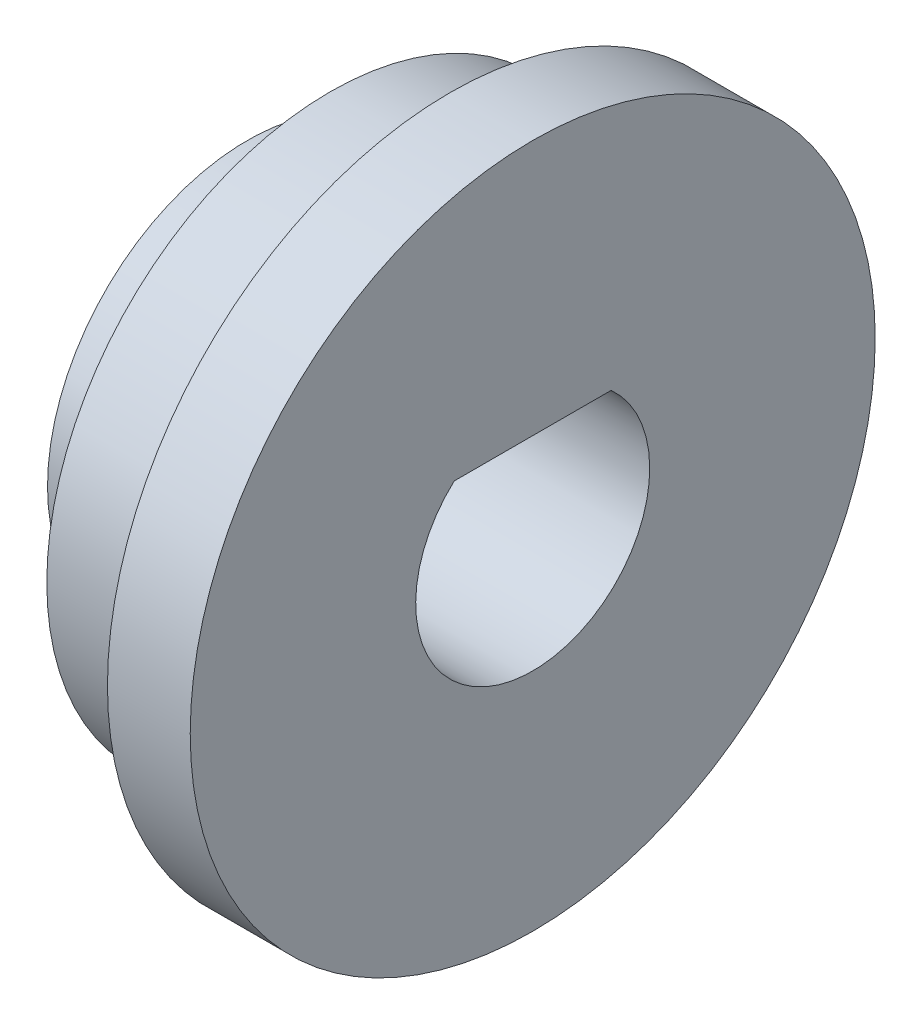
ISO-10303-21;
HEADER;
FILE_DESCRIPTION(('STEP AP214'),'2;1');
FILE_NAME('part.step','',(''),(''),'','','');
FILE_SCHEMA(('AUTOMOTIVE_DESIGN { 1 0 10303 214 1 1 1 1 }'));
ENDSEC;
DATA;
#1=APPLICATION_CONTEXT('core data for automotive mechanical design processes');
#2=APPLICATION_PROTOCOL_DEFINITION('international standard','automotive_design',2000,#1);
#3=PRODUCT_CONTEXT('',#1,'mechanical');
#4=PRODUCT('Part','Part','',(#3));
#5=PRODUCT_RELATED_PRODUCT_CATEGORY('part','',(#4));
#6=PRODUCT_DEFINITION_FORMATION('','',#4);
#7=PRODUCT_DEFINITION_CONTEXT('part definition',#1,'design');
#8=PRODUCT_DEFINITION('design','',#6,#7);
#9=PRODUCT_DEFINITION_SHAPE('','',#8);
#10=(LENGTH_UNIT() NAMED_UNIT(*) SI_UNIT(.MILLI.,.METRE.));
#11=(NAMED_UNIT(*) PLANE_ANGLE_UNIT() SI_UNIT($,.RADIAN.));
#12=(NAMED_UNIT(*) SI_UNIT($,.STERADIAN.) SOLID_ANGLE_UNIT());
#13=UNCERTAINTY_MEASURE_WITH_UNIT(LENGTH_MEASURE(1.E-05),#10,'distance_accuracy_value','');
#14=(GEOMETRIC_REPRESENTATION_CONTEXT(3) GLOBAL_UNCERTAINTY_ASSIGNED_CONTEXT((#13)) GLOBAL_UNIT_ASSIGNED_CONTEXT((#10,
#11,#12)) REPRESENTATION_CONTEXT('',''));
#15=CARTESIAN_POINT('',(0.,0.,0.));
#16=DIRECTION('',(0.,0.,1.));
#17=DIRECTION('',(1.,0.,0.));
#18=AXIS2_PLACEMENT_3D('',#15,#16,#17);
#19=CARTESIAN_POINT('',(0.,0.,0.));
#20=DIRECTION('',(-1.,0.,0.));
#21=DIRECTION('',(0.,0.,1.));
#22=AXIS2_PLACEMENT_3D('',#19,#20,#21);
#23=PLANE('',#22);
#24=CARTESIAN_POINT('',(0.,0.,0.));
#25=DIRECTION('',(-1.,0.,0.));
#26=DIRECTION('',(0.,0.,1.));
#27=AXIS2_PLACEMENT_3D('',#24,#25,#26);
#28=CIRCLE('',#27,4.1);
#29=CARTESIAN_POINT('',(0.,3.04097023990699,-2.75));
#30=VERTEX_POINT('',#29);
#31=CARTESIAN_POINT('',(0.,3.04097023990699,2.75));
#32=VERTEX_POINT('',#31);
#33=EDGE_CURVE('E54',#30,#32,#28,.T.);
#34=ORIENTED_EDGE('',*,*,#33,.F.);
#35=DIRECTION('',(0.,0.,-1.));
#36=VECTOR('',#35,1.);
#37=CARTESIAN_POINT('',(0.,3.04097023990699,-2.75));
#38=LINE('',#37,#36);
#39=EDGE_CURVE('E73',#32,#30,#38,.T.);
#40=ORIENTED_EDGE('',*,*,#39,.F.);
#41=EDGE_LOOP('',(#34,#40));
#42=FACE_BOUND('',#41,.T.);
#43=CARTESIAN_POINT('',(0.,0.,0.));
#44=DIRECTION('',(1.,0.,0.));
#45=DIRECTION('',(0.,0.,-1.));
#46=AXIS2_PLACEMENT_3D('',#43,#44,#45);
#47=CIRCLE('',#46,7.);
#48=CARTESIAN_POINT('',(0.,0.,-7.));
#49=VERTEX_POINT('',#48);
#50=EDGE_CURVE('E11',#49,#49,#47,.T.);
#51=ORIENTED_EDGE('',*,*,#50,.F.);
#52=EDGE_LOOP('',(#51));
#53=FACE_BOUND('',#52,.T.);
#54=ADVANCED_FACE('F41',(#42,#53),#23,.T.);
#55=CARTESIAN_POINT('',(0.,0.,0.));
#56=DIRECTION('',(1.,0.,0.));
#57=DIRECTION('',(0.,0.,-1.));
#58=AXIS2_PLACEMENT_3D('',#55,#56,#57);
#59=CYLINDRICAL_SURFACE('',#58,7.);
#60=ORIENTED_EDGE('',*,*,#50,.T.);
#61=EDGE_LOOP('',(#60));
#62=FACE_BOUND('',#61,.T.);
#63=CARTESIAN_POINT('',(2.9,0.,0.));
#64=DIRECTION('',(1.,0.,0.));
#65=DIRECTION('',(0.,0.,-1.));
#66=AXIS2_PLACEMENT_3D('',#63,#64,#65);
#67=CIRCLE('',#66,7.);
#68=CARTESIAN_POINT('',(2.9,0.,-7.));
#69=VERTEX_POINT('',#68);
#70=EDGE_CURVE('E48',#69,#69,#67,.T.);
#71=ORIENTED_EDGE('',*,*,#70,.F.);
#72=EDGE_LOOP('',(#71));
#73=FACE_BOUND('',#72,.T.);
#74=ADVANCED_FACE('F105',(#62,#73),#59,.T.);
#75=CARTESIAN_POINT('',(2.9,7.,0.));
#76=DIRECTION('',(-1.,0.,0.));
#77=DIRECTION('',(0.,0.,1.));
#78=AXIS2_PLACEMENT_3D('',#75,#76,#77);
#79=PLANE('',#78);
#80=ORIENTED_EDGE('',*,*,#70,.T.);
#81=EDGE_LOOP('',(#80));
#82=FACE_BOUND('',#81,.T.);
#83=CARTESIAN_POINT('',(2.9,0.,0.));
#84=DIRECTION('',(1.,0.,0.));
#85=DIRECTION('',(0.,0.,-1.));
#86=AXIS2_PLACEMENT_3D('',#83,#84,#85);
#87=CIRCLE('',#86,9.925);
#88=CARTESIAN_POINT('',(2.9,0.,-9.925));
#89=VERTEX_POINT('',#88);
#90=EDGE_CURVE('E94',#89,#89,#87,.T.);
#91=ORIENTED_EDGE('',*,*,#90,.F.);
#92=EDGE_LOOP('',(#91));
#93=FACE_BOUND('',#92,.T.);
#94=ADVANCED_FACE('F97',(#82,#93),#79,.T.);
#95=CARTESIAN_POINT('',(0.,0.,0.));
#96=DIRECTION('',(1.,0.,0.));
#97=DIRECTION('',(0.,0.,-1.));
#98=AXIS2_PLACEMENT_3D('',#95,#96,#97);
#99=CYLINDRICAL_SURFACE('',#98,9.925);
#100=ORIENTED_EDGE('',*,*,#90,.T.);
#101=EDGE_LOOP('',(#100));
#102=FACE_BOUND('',#101,.T.);
#103=CARTESIAN_POINT('',(7.1,0.,0.));
#104=DIRECTION('',(1.,0.,0.));
#105=DIRECTION('',(0.,0.,-1.));
#106=AXIS2_PLACEMENT_3D('',#103,#104,#105);
#107=CIRCLE('',#106,9.925);
#108=CARTESIAN_POINT('',(7.1,0.,-9.925));
#109=VERTEX_POINT('',#108);
#110=EDGE_CURVE('E93',#109,#109,#107,.T.);
#111=ORIENTED_EDGE('',*,*,#110,.F.);
#112=EDGE_LOOP('',(#111));
#113=FACE_BOUND('',#112,.T.);
#114=ADVANCED_FACE('F107',(#102,#113),#99,.T.);
#115=CARTESIAN_POINT('',(7.1,9.925,0.));
#116=DIRECTION('',(-1.,0.,0.));
#117=DIRECTION('',(0.,0.,1.));
#118=AXIS2_PLACEMENT_3D('',#115,#116,#117);
#119=PLANE('',#118);
#120=ORIENTED_EDGE('',*,*,#110,.T.);
#121=EDGE_LOOP('',(#120));
#122=FACE_BOUND('',#121,.T.);
#123=CARTESIAN_POINT('',(7.1,0.,0.));
#124=DIRECTION('',(1.,0.,0.));
#125=DIRECTION('',(0.,0.,-1.));
#126=AXIS2_PLACEMENT_3D('',#123,#124,#125);
#127=CIRCLE('',#126,12.);
#128=CARTESIAN_POINT('',(7.1,0.,-12.));
#129=VERTEX_POINT('',#128);
#130=EDGE_CURVE('E86',#129,#129,#127,.T.);
#131=ORIENTED_EDGE('',*,*,#130,.F.);
#132=EDGE_LOOP('',(#131));
#133=FACE_BOUND('',#132,.T.);
#134=ADVANCED_FACE('F111',(#122,#133),#119,.T.);
#135=CARTESIAN_POINT('',(0.,0.,0.));
#136=DIRECTION('',(1.,0.,0.));
#137=DIRECTION('',(0.,0.,-1.));
#138=AXIS2_PLACEMENT_3D('',#135,#136,#137);
#139=CYLINDRICAL_SURFACE('',#138,12.);
#140=ORIENTED_EDGE('',*,*,#130,.T.);
#141=EDGE_LOOP('',(#140));
#142=FACE_BOUND('',#141,.T.);
#143=CARTESIAN_POINT('',(10.,0.,0.));
#144=DIRECTION('',(1.,0.,0.));
#145=DIRECTION('',(0.,0.,-1.));
#146=AXIS2_PLACEMENT_3D('',#143,#144,#145);
#147=CIRCLE('',#146,12.);
#148=CARTESIAN_POINT('',(10.,0.,-12.));
#149=VERTEX_POINT('',#148);
#150=EDGE_CURVE('E72',#149,#149,#147,.T.);
#151=ORIENTED_EDGE('',*,*,#150,.F.);
#152=EDGE_LOOP('',(#151));
#153=FACE_BOUND('',#152,.T.);
#154=ADVANCED_FACE('F116',(#142,#153),#139,.T.);
#155=CARTESIAN_POINT('',(10.,12.,0.));
#156=DIRECTION('',(1.,0.,0.));
#157=DIRECTION('',(0.,0.,-1.));
#158=AXIS2_PLACEMENT_3D('',#155,#156,#157);
#159=PLANE('',#158);
#160=CARTESIAN_POINT('',(10.,0.,0.));
#161=DIRECTION('',(-1.,0.,0.));
#162=DIRECTION('',(0.,0.,1.));
#163=AXIS2_PLACEMENT_3D('',#160,#161,#162);
#164=CIRCLE('',#163,4.1);
#165=CARTESIAN_POINT('',(10.,3.04097023990699,-2.75));
#166=VERTEX_POINT('',#165);
#167=CARTESIAN_POINT('',(10.,3.04097023990699,2.75));
#168=VERTEX_POINT('',#167);
#169=EDGE_CURVE('E58',#166,#168,#164,.T.);
#170=ORIENTED_EDGE('',*,*,#169,.T.);
#171=DIRECTION('',(0.,0.,-1.));
#172=VECTOR('',#171,1.);
#173=CARTESIAN_POINT('',(10.,3.04097023990699,-2.75));
#174=LINE('',#173,#172);
#175=EDGE_CURVE('E85',#168,#166,#174,.T.);
#176=ORIENTED_EDGE('',*,*,#175,.T.);
#177=EDGE_LOOP('',(#170,#176));
#178=FACE_BOUND('',#177,.T.);
#179=ORIENTED_EDGE('',*,*,#150,.T.);
#180=EDGE_LOOP('',(#179));
#181=FACE_BOUND('',#180,.T.);
#182=ADVANCED_FACE('F125',(#178,#181),#159,.T.);
#183=CARTESIAN_POINT('',(10.,0.,0.));
#184=DIRECTION('',(-1.,0.,0.));
#185=DIRECTION('',(0.,0.,1.));
#186=AXIS2_PLACEMENT_3D('',#183,#184,#185);
#187=CYLINDRICAL_SURFACE('',#186,4.1);
#188=ORIENTED_EDGE('',*,*,#33,.T.);
#189=DIRECTION('',(-1.,0.,0.));
#190=VECTOR('',#189,1.);
#191=CARTESIAN_POINT('',(10.,3.04097023990699,2.75));
#192=LINE('',#191,#190);
#193=EDGE_CURVE('E75',#168,#32,#192,.T.);
#194=ORIENTED_EDGE('',*,*,#193,.F.);
#195=ORIENTED_EDGE('',*,*,#169,.F.);
#196=DIRECTION('',(-1.,0.,0.));
#197=VECTOR('',#196,1.);
#198=CARTESIAN_POINT('',(10.,3.04097023990699,-2.75));
#199=LINE('',#198,#197);
#200=EDGE_CURVE('E62',#166,#30,#199,.T.);
#201=ORIENTED_EDGE('',*,*,#200,.T.);
#202=EDGE_LOOP('',(#188,#194,#195,#201));
#203=FACE_BOUND('',#202,.T.);
#204=ADVANCED_FACE('F70',(#203),#187,.F.);
#205=CARTESIAN_POINT('',(10.,3.04097023990699,-2.75));
#206=DIRECTION('',(0.,1.,0.));
#207=DIRECTION('',(0.,0.,1.));
#208=AXIS2_PLACEMENT_3D('',#205,#206,#207);
#209=PLANE('',#208);
#210=ORIENTED_EDGE('',*,*,#39,.T.);
#211=ORIENTED_EDGE('',*,*,#200,.F.);
#212=ORIENTED_EDGE('',*,*,#175,.F.);
#213=ORIENTED_EDGE('',*,*,#193,.T.);
#214=EDGE_LOOP('',(#210,#211,#212,#213));
#215=FACE_BOUND('',#214,.T.);
#216=ADVANCED_FACE('F78',(#215),#209,.F.);
#217=CLOSED_SHELL('',(#54,#74,#94,#114,#134,#154,#182,#204,#216));
#218=MANIFOLD_SOLID_BREP('B2',#217);
#219=ADVANCED_BREP_SHAPE_REPRESENTATION('',(#18,#218),#14);
#220=SHAPE_DEFINITION_REPRESENTATION(#9,#219);
ENDSEC;
END-ISO-10303-21;
